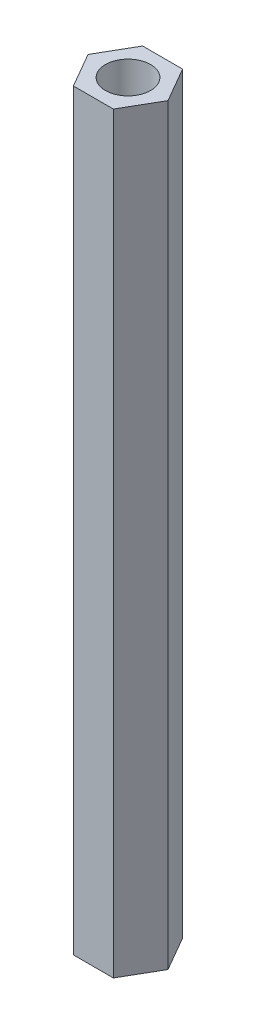
ISO-10303-21;
HEADER;
FILE_DESCRIPTION(('STEP AP214'),'2;1');
FILE_NAME('part.step','',(''),(''),'','','');
FILE_SCHEMA(('AUTOMOTIVE_DESIGN { 1 0 10303 214 1 1 1 1 }'));
ENDSEC;
DATA;
#1=APPLICATION_CONTEXT('core data for automotive mechanical design processes');
#2=APPLICATION_PROTOCOL_DEFINITION('international standard','automotive_design',2000,#1);
#3=PRODUCT_CONTEXT('',#1,'mechanical');
#4=PRODUCT('Part','Part','',(#3));
#5=PRODUCT_RELATED_PRODUCT_CATEGORY('part','',(#4));
#6=PRODUCT_DEFINITION_FORMATION('','',#4);
#7=PRODUCT_DEFINITION_CONTEXT('part definition',#1,'design');
#8=PRODUCT_DEFINITION('design','',#6,#7);
#9=PRODUCT_DEFINITION_SHAPE('','',#8);
#10=(LENGTH_UNIT() NAMED_UNIT(*) SI_UNIT(.MILLI.,.METRE.));
#11=(NAMED_UNIT(*) PLANE_ANGLE_UNIT() SI_UNIT($,.RADIAN.));
#12=(NAMED_UNIT(*) SI_UNIT($,.STERADIAN.) SOLID_ANGLE_UNIT());
#13=UNCERTAINTY_MEASURE_WITH_UNIT(LENGTH_MEASURE(1.E-05),#10,'distance_accuracy_value','');
#14=(GEOMETRIC_REPRESENTATION_CONTEXT(3) GLOBAL_UNCERTAINTY_ASSIGNED_CONTEXT((#13)) GLOBAL_UNIT_ASSIGNED_CONTEXT((#10,
#11,#12)) REPRESENTATION_CONTEXT('',''));
#15=CARTESIAN_POINT('',(0.,0.,0.));
#16=DIRECTION('',(0.,0.,1.));
#17=DIRECTION('',(1.,0.,0.));
#18=AXIS2_PLACEMENT_3D('',#15,#16,#17);
#19=CARTESIAN_POINT('',(0.,50.,0.));
#20=DIRECTION('',(0.,1.,0.));
#21=DIRECTION('',(0.,0.,1.));
#22=AXIS2_PLACEMENT_3D('',#19,#20,#21);
#23=PLANE('',#22);
#24=DIRECTION('',(0.499999999999995,0.,-0.866025403784442));
#25=VECTOR('',#24,1.);
#26=CARTESIAN_POINT('',(1.32790561913617,50.,2.29999999999999));
#27=LINE('',#26,#25);
#28=CARTESIAN_POINT('',(1.32790561913617,50.,2.29999999999999));
#29=VERTEX_POINT('',#28);
#30=CARTESIAN_POINT('',(2.65581123827228,50.,0.));
#31=VERTEX_POINT('',#30);
#32=EDGE_CURVE('E152',#29,#31,#27,.T.);
#33=ORIENTED_EDGE('',*,*,#32,.T.);
#34=DIRECTION('',(-0.500000000000001,0.,-0.866025403784438));
#35=VECTOR('',#34,1.);
#36=CARTESIAN_POINT('',(2.65581123827228,50.,0.));
#37=LINE('',#36,#35);
#38=CARTESIAN_POINT('',(1.32790561913614,50.,-2.3));
#39=VERTEX_POINT('',#38);
#40=EDGE_CURVE('E100',#31,#39,#37,.T.);
#41=ORIENTED_EDGE('',*,*,#40,.T.);
#42=DIRECTION('',(-1.,0.,0.));
#43=VECTOR('',#42,1.);
#44=CARTESIAN_POINT('',(1.32790561913614,50.,-2.3));
#45=LINE('',#44,#43);
#46=CARTESIAN_POINT('',(-1.32790561913615,50.,-2.3));
#47=VERTEX_POINT('',#46);
#48=EDGE_CURVE('E113',#39,#47,#45,.T.);
#49=ORIENTED_EDGE('',*,*,#48,.T.);
#50=DIRECTION('',(-0.499999999999995,0.,0.866025403784442));
#51=VECTOR('',#50,1.);
#52=CARTESIAN_POINT('',(-1.32790561913615,50.,-2.3));
#53=LINE('',#52,#51);
#54=CARTESIAN_POINT('',(-2.65581123827228,50.,0.));
#55=VERTEX_POINT('',#54);
#56=EDGE_CURVE('E107',#47,#55,#53,.T.);
#57=ORIENTED_EDGE('',*,*,#56,.T.);
#58=DIRECTION('',(0.500000000000007,0.,0.866025403784435));
#59=VECTOR('',#58,1.);
#60=CARTESIAN_POINT('',(-2.65581123827228,50.,0.));
#61=LINE('',#60,#59);
#62=CARTESIAN_POINT('',(-1.32790561913612,50.,2.30000000000001));
#63=VERTEX_POINT('',#62);
#64=EDGE_CURVE('E111',#55,#63,#61,.T.);
#65=ORIENTED_EDGE('',*,*,#64,.T.);
#66=DIRECTION('',(1.,0.,0.));
#67=VECTOR('',#66,1.);
#68=CARTESIAN_POINT('',(-1.32790561913612,50.,2.30000000000001));
#69=LINE('',#68,#67);
#70=EDGE_CURVE('E63',#63,#29,#69,.T.);
#71=ORIENTED_EDGE('',*,*,#70,.T.);
#72=EDGE_LOOP('',(#33,#41,#49,#57,#65,#71));
#73=FACE_BOUND('',#72,.T.);
#74=CARTESIAN_POINT('',(0.,50.,0.));
#75=DIRECTION('',(0.,1.,0.));
#76=DIRECTION('',(0.,0.,1.));
#77=AXIS2_PLACEMENT_3D('',#74,#75,#76);
#78=CIRCLE('',#77,1.5);
#79=CARTESIAN_POINT('',(0.,50.,1.5));
#80=VERTEX_POINT('',#79);
#81=EDGE_CURVE('E140',#80,#80,#78,.T.);
#82=ORIENTED_EDGE('',*,*,#81,.F.);
#83=EDGE_LOOP('',(#82));
#84=FACE_BOUND('',#83,.T.);
#85=ADVANCED_FACE('F45',(#73,#84),#23,.T.);
#86=CARTESIAN_POINT('',(0.,0.,0.));
#87=DIRECTION('',(0.,1.,0.));
#88=DIRECTION('',(0.,0.,1.));
#89=AXIS2_PLACEMENT_3D('',#86,#87,#88);
#90=PLANE('',#89);
#91=DIRECTION('',(0.499999999999995,0.,-0.866025403784442));
#92=VECTOR('',#91,1.);
#93=CARTESIAN_POINT('',(1.32790561913617,0.,2.29999999999999));
#94=LINE('',#93,#92);
#95=CARTESIAN_POINT('',(1.32790561913617,0.,2.29999999999999));
#96=VERTEX_POINT('',#95);
#97=CARTESIAN_POINT('',(2.65581123827228,0.,0.));
#98=VERTEX_POINT('',#97);
#99=EDGE_CURVE('E135',#96,#98,#94,.T.);
#100=ORIENTED_EDGE('',*,*,#99,.F.);
#101=DIRECTION('',(1.,0.,0.));
#102=VECTOR('',#101,1.);
#103=CARTESIAN_POINT('',(-1.32790561913612,0.,2.30000000000001));
#104=LINE('',#103,#102);
#105=CARTESIAN_POINT('',(-1.32790561913612,0.,2.30000000000001));
#106=VERTEX_POINT('',#105);
#107=EDGE_CURVE('E92',#106,#96,#104,.T.);
#108=ORIENTED_EDGE('',*,*,#107,.F.);
#109=DIRECTION('',(0.500000000000007,0.,0.866025403784435));
#110=VECTOR('',#109,1.);
#111=CARTESIAN_POINT('',(-2.65581123827228,0.,0.));
#112=LINE('',#111,#110);
#113=CARTESIAN_POINT('',(-2.65581123827228,0.,0.));
#114=VERTEX_POINT('',#113);
#115=EDGE_CURVE('E86',#114,#106,#112,.T.);
#116=ORIENTED_EDGE('',*,*,#115,.F.);
#117=DIRECTION('',(-0.499999999999995,0.,0.866025403784442));
#118=VECTOR('',#117,1.);
#119=CARTESIAN_POINT('',(-1.32790561913615,0.,-2.3));
#120=LINE('',#119,#118);
#121=CARTESIAN_POINT('',(-1.32790561913615,0.,-2.3));
#122=VERTEX_POINT('',#121);
#123=EDGE_CURVE('E122',#122,#114,#120,.T.);
#124=ORIENTED_EDGE('',*,*,#123,.F.);
#125=DIRECTION('',(-1.,0.,0.));
#126=VECTOR('',#125,1.);
#127=CARTESIAN_POINT('',(1.32790561913614,0.,-2.3));
#128=LINE('',#127,#126);
#129=CARTESIAN_POINT('',(1.32790561913614,0.,-2.3));
#130=VERTEX_POINT('',#129);
#131=EDGE_CURVE('E143',#130,#122,#128,.T.);
#132=ORIENTED_EDGE('',*,*,#131,.F.);
#133=DIRECTION('',(-0.500000000000001,0.,-0.866025403784438));
#134=VECTOR('',#133,1.);
#135=CARTESIAN_POINT('',(2.65581123827228,0.,0.));
#136=LINE('',#135,#134);
#137=EDGE_CURVE('E139',#98,#130,#136,.T.);
#138=ORIENTED_EDGE('',*,*,#137,.F.);
#139=EDGE_LOOP('',(#100,#108,#116,#124,#132,#138));
#140=FACE_BOUND('',#139,.T.);
#141=CARTESIAN_POINT('',(0.,0.,0.));
#142=DIRECTION('',(0.,1.,0.));
#143=DIRECTION('',(0.,0.,1.));
#144=AXIS2_PLACEMENT_3D('',#141,#142,#143);
#145=CIRCLE('',#144,1.5);
#146=CARTESIAN_POINT('',(0.,0.,1.5));
#147=VERTEX_POINT('',#146);
#148=EDGE_CURVE('E249',#147,#147,#145,.T.);
#149=ORIENTED_EDGE('',*,*,#148,.T.);
#150=EDGE_LOOP('',(#149));
#151=FACE_BOUND('',#150,.T.);
#152=ADVANCED_FACE('F165',(#140,#151),#90,.F.);
#153=CARTESIAN_POINT('',(1.32790561913617,50.,2.29999999999999));
#154=DIRECTION('',(-0.866025403784442,0.,-0.499999999999995));
#155=DIRECTION('',(-0.499999999999995,0.,0.866025403784442));
#156=AXIS2_PLACEMENT_3D('',#153,#154,#155);
#157=PLANE('',#156);
#158=ORIENTED_EDGE('',*,*,#99,.T.);
#159=DIRECTION('',(0.,-1.,0.));
#160=VECTOR('',#159,1.);
#161=CARTESIAN_POINT('',(2.65581123827228,50.,0.));
#162=LINE('',#161,#160);
#163=EDGE_CURVE('E11',#31,#98,#162,.T.);
#164=ORIENTED_EDGE('',*,*,#163,.F.);
#165=ORIENTED_EDGE('',*,*,#32,.F.);
#166=DIRECTION('',(0.,-1.,0.));
#167=VECTOR('',#166,1.);
#168=CARTESIAN_POINT('',(1.32790561913617,50.,2.29999999999999));
#169=LINE('',#168,#167);
#170=EDGE_CURVE('E131',#29,#96,#169,.T.);
#171=ORIENTED_EDGE('',*,*,#170,.T.);
#172=EDGE_LOOP('',(#158,#164,#165,#171));
#173=FACE_BOUND('',#172,.T.);
#174=ADVANCED_FACE('F47',(#173),#157,.F.);
#175=CARTESIAN_POINT('',(2.65581123827228,50.,0.));
#176=DIRECTION('',(-0.866025403784438,0.,0.500000000000001));
#177=DIRECTION('',(0.500000000000001,0.,0.866025403784438));
#178=AXIS2_PLACEMENT_3D('',#175,#176,#177);
#179=PLANE('',#178);
#180=ORIENTED_EDGE('',*,*,#137,.T.);
#181=DIRECTION('',(0.,-1.,0.));
#182=VECTOR('',#181,1.);
#183=CARTESIAN_POINT('',(1.32790561913614,50.,-2.3));
#184=LINE('',#183,#182);
#185=EDGE_CURVE('E55',#39,#130,#184,.T.);
#186=ORIENTED_EDGE('',*,*,#185,.F.);
#187=ORIENTED_EDGE('',*,*,#40,.F.);
#188=ORIENTED_EDGE('',*,*,#163,.T.);
#189=EDGE_LOOP('',(#180,#186,#187,#188));
#190=FACE_BOUND('',#189,.T.);
#191=ADVANCED_FACE('F190',(#190),#179,.F.);
#192=CARTESIAN_POINT('',(1.32790561913614,50.,-2.3));
#193=DIRECTION('',(0.,0.,1.));
#194=DIRECTION('',(1.,0.,0.));
#195=AXIS2_PLACEMENT_3D('',#192,#193,#194);
#196=PLANE('',#195);
#197=ORIENTED_EDGE('',*,*,#131,.T.);
#198=DIRECTION('',(0.,-1.,0.));
#199=VECTOR('',#198,1.);
#200=CARTESIAN_POINT('',(-1.32790561913615,50.,-2.3));
#201=LINE('',#200,#199);
#202=EDGE_CURVE('E124',#47,#122,#201,.T.);
#203=ORIENTED_EDGE('',*,*,#202,.F.);
#204=ORIENTED_EDGE('',*,*,#48,.F.);
#205=ORIENTED_EDGE('',*,*,#185,.T.);
#206=EDGE_LOOP('',(#197,#203,#204,#205));
#207=FACE_BOUND('',#206,.T.);
#208=ADVANCED_FACE('F162',(#207),#196,.F.);
#209=CARTESIAN_POINT('',(-1.32790561913615,50.,-2.3));
#210=DIRECTION('',(0.866025403784442,0.,0.499999999999995));
#211=DIRECTION('',(0.499999999999995,0.,-0.866025403784442));
#212=AXIS2_PLACEMENT_3D('',#209,#210,#211);
#213=PLANE('',#212);
#214=ORIENTED_EDGE('',*,*,#123,.T.);
#215=DIRECTION('',(0.,-1.,0.));
#216=VECTOR('',#215,1.);
#217=CARTESIAN_POINT('',(-2.65581123827228,50.,0.));
#218=LINE('',#217,#216);
#219=EDGE_CURVE('E119',#55,#114,#218,.T.);
#220=ORIENTED_EDGE('',*,*,#219,.F.);
#221=ORIENTED_EDGE('',*,*,#56,.F.);
#222=ORIENTED_EDGE('',*,*,#202,.T.);
#223=EDGE_LOOP('',(#214,#220,#221,#222));
#224=FACE_BOUND('',#223,.T.);
#225=ADVANCED_FACE('F120',(#224),#213,.F.);
#226=CARTESIAN_POINT('',(-2.65581123827228,50.,0.));
#227=DIRECTION('',(0.866025403784435,0.,-0.500000000000007));
#228=DIRECTION('',(-0.500000000000007,0.,-0.866025403784435));
#229=AXIS2_PLACEMENT_3D('',#226,#227,#228);
#230=PLANE('',#229);
#231=ORIENTED_EDGE('',*,*,#115,.T.);
#232=DIRECTION('',(0.,-1.,0.));
#233=VECTOR('',#232,1.);
#234=CARTESIAN_POINT('',(-1.32790561913612,50.,2.30000000000001));
#235=LINE('',#234,#233);
#236=EDGE_CURVE('E125',#63,#106,#235,.T.);
#237=ORIENTED_EDGE('',*,*,#236,.F.);
#238=ORIENTED_EDGE('',*,*,#64,.F.);
#239=ORIENTED_EDGE('',*,*,#219,.T.);
#240=EDGE_LOOP('',(#231,#237,#238,#239));
#241=FACE_BOUND('',#240,.T.);
#242=ADVANCED_FACE('F127',(#241),#230,.F.);
#243=CARTESIAN_POINT('',(-1.32790561913612,50.,2.30000000000001));
#244=DIRECTION('',(0.,0.,-1.));
#245=DIRECTION('',(-1.,0.,0.));
#246=AXIS2_PLACEMENT_3D('',#243,#244,#245);
#247=PLANE('',#246);
#248=ORIENTED_EDGE('',*,*,#107,.T.);
#249=ORIENTED_EDGE('',*,*,#170,.F.);
#250=ORIENTED_EDGE('',*,*,#70,.F.);
#251=ORIENTED_EDGE('',*,*,#236,.T.);
#252=EDGE_LOOP('',(#248,#249,#250,#251));
#253=FACE_BOUND('',#252,.T.);
#254=ADVANCED_FACE('F170',(#253),#247,.F.);
#255=CARTESIAN_POINT('',(0.,50.,0.));
#256=DIRECTION('',(0.,-1.,0.));
#257=DIRECTION('',(0.,0.,-1.));
#258=AXIS2_PLACEMENT_3D('',#255,#256,#257);
#259=CYLINDRICAL_SURFACE('',#258,1.5);
#260=ORIENTED_EDGE('',*,*,#81,.T.);
#261=EDGE_LOOP('',(#260));
#262=FACE_BOUND('',#261,.T.);
#263=ORIENTED_EDGE('',*,*,#148,.F.);
#264=EDGE_LOOP('',(#263));
#265=FACE_BOUND('',#264,.T.);
#266=ADVANCED_FACE('F172',(#262,#265),#259,.F.);
#267=CLOSED_SHELL('',(#85,#152,#174,#191,#208,#225,#242,#254,#266));
#268=MANIFOLD_SOLID_BREP('B2',#267);
#269=ADVANCED_BREP_SHAPE_REPRESENTATION('',(#18,#268),#14);
#270=SHAPE_DEFINITION_REPRESENTATION(#9,#269);
ENDSEC;
END-ISO-10303-21;
